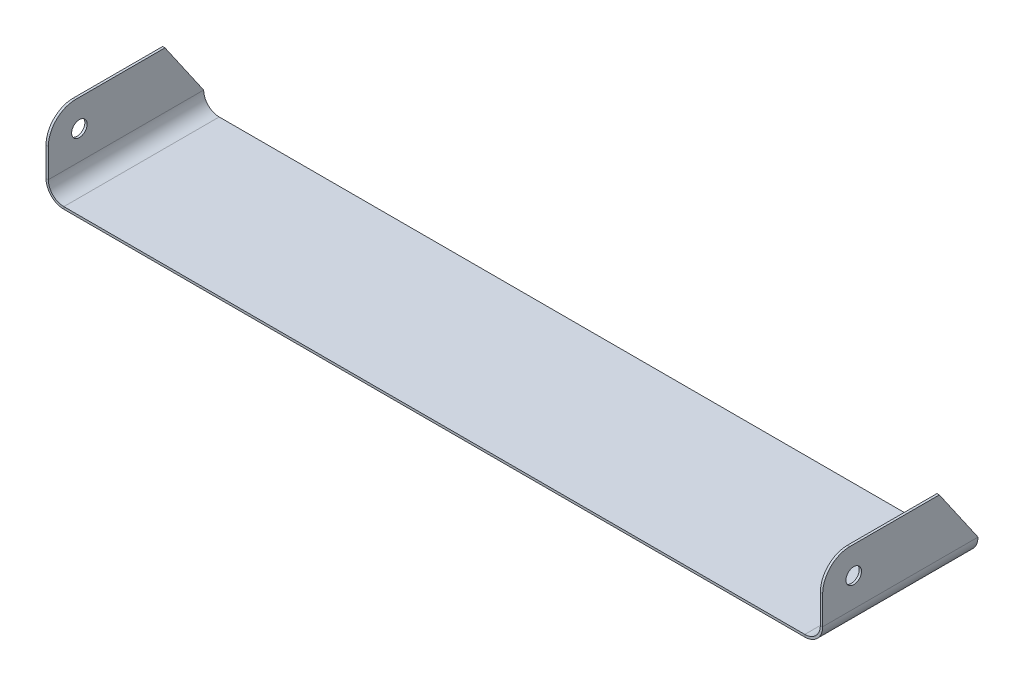
ISO-10303-21;
HEADER;
FILE_DESCRIPTION(('STEP AP214'),'2;1');
FILE_NAME('part.step','',(''),(''),'','','');
FILE_SCHEMA(('AUTOMOTIVE_DESIGN { 1 0 10303 214 1 1 1 1 }'));
ENDSEC;
DATA;
#1=APPLICATION_CONTEXT('core data for automotive mechanical design processes');
#2=APPLICATION_PROTOCOL_DEFINITION('international standard','automotive_design',2000,#1);
#3=PRODUCT_CONTEXT('',#1,'mechanical');
#4=PRODUCT('Part','Part','',(#3));
#5=PRODUCT_RELATED_PRODUCT_CATEGORY('part','',(#4));
#6=PRODUCT_DEFINITION_FORMATION('','',#4);
#7=PRODUCT_DEFINITION_CONTEXT('part definition',#1,'design');
#8=PRODUCT_DEFINITION('design','',#6,#7);
#9=PRODUCT_DEFINITION_SHAPE('','',#8);
#10=(LENGTH_UNIT() NAMED_UNIT(*) SI_UNIT(.MILLI.,.METRE.));
#11=(NAMED_UNIT(*) PLANE_ANGLE_UNIT() SI_UNIT($,.RADIAN.));
#12=(NAMED_UNIT(*) SI_UNIT($,.STERADIAN.) SOLID_ANGLE_UNIT());
#13=UNCERTAINTY_MEASURE_WITH_UNIT(LENGTH_MEASURE(1.E-05),#10,'distance_accuracy_value','');
#14=(GEOMETRIC_REPRESENTATION_CONTEXT(3) GLOBAL_UNCERTAINTY_ASSIGNED_CONTEXT((#13)) GLOBAL_UNIT_ASSIGNED_CONTEXT((#10,
#11,#12)) REPRESENTATION_CONTEXT('',''));
#15=CARTESIAN_POINT('',(0.,0.,0.));
#16=DIRECTION('',(0.,0.,1.));
#17=DIRECTION('',(1.,0.,0.));
#18=AXIS2_PLACEMENT_3D('',#15,#16,#17);
#19=CARTESIAN_POINT('',(0.,-3.,0.));
#20=DIRECTION('',(0.,1.,0.));
#21=DIRECTION('',(0.,0.,1.));
#22=AXIS2_PLACEMENT_3D('',#19,#20,#21);
#23=PLANE('',#22);
#24=DIRECTION('',(0.,0.,-1.));
#25=VECTOR('',#24,1.);
#26=CARTESIAN_POINT('',(477.,-3.00000000000004,-100.));
#27=LINE('',#26,#25);
#28=CARTESIAN_POINT('',(477.,-3.00000000000004,-100.));
#29=VERTEX_POINT('',#28);
#30=CARTESIAN_POINT('',(477.,-3.,100.));
#31=VERTEX_POINT('',#30);
#32=EDGE_CURVE('E204',#29,#31,#27,.F.);
#33=ORIENTED_EDGE('',*,*,#32,.T.);
#34=DIRECTION('',(1.,0.,0.));
#35=VECTOR('',#34,1.);
#36=CARTESIAN_POINT('',(-500.,-3.,100.));
#37=LINE('',#36,#35);
#38=CARTESIAN_POINT('',(-477.,-3.00000000000004,100.));
#39=VERTEX_POINT('',#38);
#40=EDGE_CURVE('E97',#39,#31,#37,.T.);
#41=ORIENTED_EDGE('',*,*,#40,.F.);
#42=DIRECTION('',(0.,0.,1.));
#43=VECTOR('',#42,1.);
#44=CARTESIAN_POINT('',(-477.,-3.00000000000004,100.));
#45=LINE('',#44,#43);
#46=CARTESIAN_POINT('',(-477.,-3.,-100.));
#47=VERTEX_POINT('',#46);
#48=EDGE_CURVE('E280',#39,#47,#45,.F.);
#49=ORIENTED_EDGE('',*,*,#48,.T.);
#50=DIRECTION('',(-1.,0.,0.));
#51=VECTOR('',#50,1.);
#52=CARTESIAN_POINT('',(-500.,-3.,-100.));
#53=LINE('',#52,#51);
#54=EDGE_CURVE('E304',#29,#47,#53,.T.);
#55=ORIENTED_EDGE('',*,*,#54,.F.);
#56=EDGE_LOOP('',(#33,#41,#49,#55));
#57=FACE_BOUND('',#56,.T.);
#58=ADVANCED_FACE('F88',(#57),#23,.F.);
#59=CARTESIAN_POINT('',(0.,0.,0.));
#60=DIRECTION('',(0.,1.,0.));
#61=DIRECTION('',(0.,0.,1.));
#62=AXIS2_PLACEMENT_3D('',#59,#60,#61);
#63=PLANE('',#62);
#64=DIRECTION('',(1.,0.,0.));
#65=VECTOR('',#64,1.);
#66=CARTESIAN_POINT('',(-500.,0.,100.));
#67=LINE('',#66,#65);
#68=CARTESIAN_POINT('',(-477.,0.,100.));
#69=VERTEX_POINT('',#68);
#70=CARTESIAN_POINT('',(477.,0.,100.));
#71=VERTEX_POINT('',#70);
#72=EDGE_CURVE('E306',#69,#71,#67,.T.);
#73=ORIENTED_EDGE('',*,*,#72,.T.);
#74=DIRECTION('',(0.,0.,-1.));
#75=VECTOR('',#74,1.);
#76=CARTESIAN_POINT('',(477.,0.,-100.));
#77=LINE('',#76,#75);
#78=CARTESIAN_POINT('',(477.,0.,-100.));
#79=VERTEX_POINT('',#78);
#80=EDGE_CURVE('E239',#79,#71,#77,.F.);
#81=ORIENTED_EDGE('',*,*,#80,.F.);
#82=DIRECTION('',(-1.,0.,0.));
#83=VECTOR('',#82,1.);
#84=CARTESIAN_POINT('',(-500.,0.,-100.));
#85=LINE('',#84,#83);
#86=CARTESIAN_POINT('',(-477.,0.,-100.));
#87=VERTEX_POINT('',#86);
#88=EDGE_CURVE('E301',#79,#87,#85,.T.);
#89=ORIENTED_EDGE('',*,*,#88,.T.);
#90=DIRECTION('',(0.,0.,1.));
#91=VECTOR('',#90,1.);
#92=CARTESIAN_POINT('',(-477.,0.,100.));
#93=LINE('',#92,#91);
#94=EDGE_CURVE('E293',#69,#87,#93,.F.);
#95=ORIENTED_EDGE('',*,*,#94,.F.);
#96=EDGE_LOOP('',(#73,#81,#89,#95));
#97=FACE_BOUND('',#96,.T.);
#98=ADVANCED_FACE('F313',(#97),#63,.T.);
#99=CARTESIAN_POINT('',(-500.,-3.,-100.));
#100=DIRECTION('',(0.,0.,-1.));
#101=DIRECTION('',(-1.,0.,0.));
#102=AXIS2_PLACEMENT_3D('',#99,#100,#101);
#103=PLANE('',#102);
#104=ORIENTED_EDGE('',*,*,#88,.F.);
#105=DIRECTION('',(0.,-1.,0.));
#106=VECTOR('',#105,1.);
#107=CARTESIAN_POINT('',(477.,0.,-100.));
#108=LINE('',#107,#106);
#109=EDGE_CURVE('E235',#79,#29,#108,.T.);
#110=ORIENTED_EDGE('',*,*,#109,.T.);
#111=ORIENTED_EDGE('',*,*,#54,.T.);
#112=DIRECTION('',(0.,-1.,0.));
#113=VECTOR('',#112,1.);
#114=CARTESIAN_POINT('',(-477.,0.,-100.));
#115=LINE('',#114,#113);
#116=EDGE_CURVE('E298',#87,#47,#115,.T.);
#117=ORIENTED_EDGE('',*,*,#116,.F.);
#118=EDGE_LOOP('',(#104,#110,#111,#117));
#119=FACE_BOUND('',#118,.T.);
#120=ADVANCED_FACE('F90',(#119),#103,.T.);
#121=CARTESIAN_POINT('',(-500.,-3.,100.));
#122=DIRECTION('',(0.,0.,1.));
#123=DIRECTION('',(1.,0.,0.));
#124=AXIS2_PLACEMENT_3D('',#121,#122,#123);
#125=PLANE('',#124);
#126=DIRECTION('',(0.,-1.,0.));
#127=VECTOR('',#126,1.);
#128=CARTESIAN_POINT('',(477.,0.,100.));
#129=LINE('',#128,#127);
#130=EDGE_CURVE('E244',#71,#31,#129,.T.);
#131=ORIENTED_EDGE('',*,*,#130,.F.);
#132=ORIENTED_EDGE('',*,*,#72,.F.);
#133=DIRECTION('',(0.,-1.,0.));
#134=VECTOR('',#133,1.);
#135=CARTESIAN_POINT('',(-477.,0.,100.));
#136=LINE('',#135,#134);
#137=EDGE_CURVE('E287',#69,#39,#136,.T.);
#138=ORIENTED_EDGE('',*,*,#137,.T.);
#139=ORIENTED_EDGE('',*,*,#40,.T.);
#140=EDGE_LOOP('',(#131,#132,#138,#139));
#141=FACE_BOUND('',#140,.T.);
#142=ADVANCED_FACE('F381',(#141),#125,.T.);
#143=CARTESIAN_POINT('',(-477.,20.,-100.));
#144=DIRECTION('',(0.,0.,-1.));
#145=DIRECTION('',(-1.,0.,0.));
#146=AXIS2_PLACEMENT_3D('',#143,#144,#145);
#147=PLANE('',#146);
#148=DIRECTION('',(1.,0.,0.));
#149=VECTOR('',#148,1.);
#150=CARTESIAN_POINT('',(-500.,19.9999999999999,-100.));
#151=LINE('',#150,#149);
#152=CARTESIAN_POINT('',(-497.,19.9999999999999,-100.));
#153=VERTEX_POINT('',#152);
#154=CARTESIAN_POINT('',(-500.,19.9999999999999,-100.));
#155=VERTEX_POINT('',#154);
#156=EDGE_CURVE('E247',#153,#155,#151,.F.);
#157=ORIENTED_EDGE('',*,*,#156,.F.);
#158=CARTESIAN_POINT('',(-477.,20.,-100.));
#159=DIRECTION('',(0.,0.,1.));
#160=DIRECTION('',(1.,0.,0.));
#161=AXIS2_PLACEMENT_3D('',#158,#159,#160);
#162=CIRCLE('',#161,20.);
#163=EDGE_CURVE('E290',#87,#153,#162,.F.);
#164=ORIENTED_EDGE('',*,*,#163,.F.);
#165=ORIENTED_EDGE('',*,*,#116,.T.);
#166=CARTESIAN_POINT('',(-477.,20.,-100.));
#167=DIRECTION('',(0.,0.,1.));
#168=DIRECTION('',(1.,0.,0.));
#169=AXIS2_PLACEMENT_3D('',#166,#167,#168);
#170=CIRCLE('',#169,23.);
#171=EDGE_CURVE('E283',#47,#155,#170,.F.);
#172=ORIENTED_EDGE('',*,*,#171,.T.);
#173=EDGE_LOOP('',(#157,#164,#165,#172));
#174=FACE_BOUND('',#173,.T.);
#175=ADVANCED_FACE('F383',(#174),#147,.T.);
#176=CARTESIAN_POINT('',(-477.,20.,100.));
#177=DIRECTION('',(0.,0.,-1.));
#178=DIRECTION('',(-1.,0.,0.));
#179=AXIS2_PLACEMENT_3D('',#176,#177,#178);
#180=PLANE('',#179);
#181=CARTESIAN_POINT('',(-477.,20.,100.));
#182=DIRECTION('',(0.,0.,1.));
#183=DIRECTION('',(1.,0.,0.));
#184=AXIS2_PLACEMENT_3D('',#181,#182,#183);
#185=CIRCLE('',#184,20.);
#186=CARTESIAN_POINT('',(-497.,19.9999999999999,100.));
#187=VERTEX_POINT('',#186);
#188=EDGE_CURVE('E257',#187,#69,#185,.T.);
#189=ORIENTED_EDGE('',*,*,#188,.F.);
#190=DIRECTION('',(1.,0.,0.));
#191=VECTOR('',#190,1.);
#192=CARTESIAN_POINT('',(-497.,19.9999999999999,100.));
#193=LINE('',#192,#191);
#194=CARTESIAN_POINT('',(-500.,19.9999999999999,100.));
#195=VERTEX_POINT('',#194);
#196=EDGE_CURVE('E274',#187,#195,#193,.F.);
#197=ORIENTED_EDGE('',*,*,#196,.T.);
#198=CARTESIAN_POINT('',(-477.,20.,100.));
#199=DIRECTION('',(0.,0.,1.));
#200=DIRECTION('',(1.,0.,0.));
#201=AXIS2_PLACEMENT_3D('',#198,#199,#200);
#202=CIRCLE('',#201,23.);
#203=EDGE_CURVE('E284',#195,#39,#202,.T.);
#204=ORIENTED_EDGE('',*,*,#203,.T.);
#205=ORIENTED_EDGE('',*,*,#137,.F.);
#206=EDGE_LOOP('',(#189,#197,#204,#205));
#207=FACE_BOUND('',#206,.T.);
#208=ADVANCED_FACE('F379',(#207),#180,.F.);
#209=CARTESIAN_POINT('',(-477.,20.,100.));
#210=DIRECTION('',(0.,0.,1.));
#211=DIRECTION('',(-1.,0.,0.));
#212=AXIS2_PLACEMENT_3D('',#209,#210,#211);
#213=CYLINDRICAL_SURFACE('',#212,23.);
#214=ORIENTED_EDGE('',*,*,#48,.F.);
#215=ORIENTED_EDGE('',*,*,#203,.F.);
#216=DIRECTION('',(0.,0.,1.));
#217=VECTOR('',#216,1.);
#218=CARTESIAN_POINT('',(-500.,19.9999999999999,65.));
#219=LINE('',#218,#217);
#220=EDGE_CURVE('E271',#155,#195,#219,.T.);
#221=ORIENTED_EDGE('',*,*,#220,.F.);
#222=ORIENTED_EDGE('',*,*,#171,.F.);
#223=EDGE_LOOP('',(#214,#215,#221,#222));
#224=FACE_BOUND('',#223,.T.);
#225=ADVANCED_FACE('F408',(#224),#213,.T.);
#226=CARTESIAN_POINT('',(-477.,20.,100.));
#227=DIRECTION('',(0.,0.,1.));
#228=DIRECTION('',(-1.,0.,0.));
#229=AXIS2_PLACEMENT_3D('',#226,#227,#228);
#230=CYLINDRICAL_SURFACE('',#229,20.);
#231=ORIENTED_EDGE('',*,*,#94,.T.);
#232=ORIENTED_EDGE('',*,*,#163,.T.);
#233=DIRECTION('',(0.,0.,-1.));
#234=VECTOR('',#233,1.);
#235=CARTESIAN_POINT('',(-497.,19.9999999999999,-100.));
#236=LINE('',#235,#234);
#237=EDGE_CURVE('E277',#153,#187,#236,.F.);
#238=ORIENTED_EDGE('',*,*,#237,.T.);
#239=ORIENTED_EDGE('',*,*,#188,.T.);
#240=EDGE_LOOP('',(#231,#232,#238,#239));
#241=FACE_BOUND('',#240,.T.);
#242=ADVANCED_FACE('F395',(#241),#230,.F.);
#243=CARTESIAN_POINT('',(-500.,56.9999999999997,100.));
#244=DIRECTION('',(0.,0.,-1.));
#245=DIRECTION('',(-1.,0.,0.));
#246=AXIS2_PLACEMENT_3D('',#243,#244,#245);
#247=PLANE('',#246);
#248=ORIENTED_EDGE('',*,*,#196,.F.);
#249=DIRECTION('',(0.,1.,0.));
#250=VECTOR('',#249,1.);
#251=CARTESIAN_POINT('',(-497.,56.9999999999998,100.));
#252=LINE('',#251,#250);
#253=CARTESIAN_POINT('',(-497.,56.9999999999999,100.));
#254=VERTEX_POINT('',#253);
#255=EDGE_CURVE('E269',#187,#254,#252,.T.);
#256=ORIENTED_EDGE('',*,*,#255,.T.);
#257=DIRECTION('',(1.,0.,0.));
#258=VECTOR('',#257,1.);
#259=CARTESIAN_POINT('',(-500.,56.9999999999997,100.));
#260=LINE('',#259,#258);
#261=CARTESIAN_POINT('',(-500.,56.9999999999999,100.));
#262=VERTEX_POINT('',#261);
#263=EDGE_CURVE('E253',#262,#254,#260,.T.);
#264=ORIENTED_EDGE('',*,*,#263,.F.);
#265=DIRECTION('',(0.,-1.,0.));
#266=VECTOR('',#265,1.);
#267=CARTESIAN_POINT('',(-500.,57.,100.));
#268=LINE('',#267,#266);
#269=EDGE_CURVE('E262',#195,#262,#268,.F.);
#270=ORIENTED_EDGE('',*,*,#269,.F.);
#271=EDGE_LOOP('',(#248,#256,#264,#270));
#272=FACE_BOUND('',#271,.T.);
#273=ADVANCED_FACE('F413',(#272),#247,.F.);
#274=CARTESIAN_POINT('',(-500.,57.,65.));
#275=DIRECTION('',(-1.,0.,0.));
#276=DIRECTION('',(0.,-1.,0.));
#277=AXIS2_PLACEMENT_3D('',#274,#275,#276);
#278=PLANE('',#277);
#279=DIRECTION('',(0.,0.822276678257091,0.56908792325482));
#280=VECTOR('',#279,1.);
#281=CARTESIAN_POINT('',(-500.,19.9999999999999,-100.));
#282=LINE('',#281,#280);
#283=CARTESIAN_POINT('',(-500.,92.,-50.1696551078199));
#284=VERTEX_POINT('',#283);
#285=EDGE_CURVE('E104',#155,#284,#282,.T.);
#286=ORIENTED_EDGE('',*,*,#285,.F.);
#287=ORIENTED_EDGE('',*,*,#220,.T.);
#288=ORIENTED_EDGE('',*,*,#269,.T.);
#289=CARTESIAN_POINT('',(-500.,57.,65.));
#290=DIRECTION('',(-1.,0.,0.));
#291=DIRECTION('',(0.,-1.,0.));
#292=AXIS2_PLACEMENT_3D('',#289,#290,#291);
#293=CIRCLE('',#292,35.);
#294=CARTESIAN_POINT('',(-500.,92.,64.9999999999998));
#295=VERTEX_POINT('',#294);
#296=EDGE_CURVE('E260',#262,#295,#293,.T.);
#297=ORIENTED_EDGE('',*,*,#296,.T.);
#298=DIRECTION('',(0.,0.,1.));
#299=VECTOR('',#298,1.);
#300=CARTESIAN_POINT('',(-500.,92.,65.));
#301=LINE('',#300,#299);
#302=EDGE_CURVE('E254',#295,#284,#301,.F.);
#303=ORIENTED_EDGE('',*,*,#302,.T.);
#304=EDGE_LOOP('',(#286,#287,#288,#297,#303));
#305=FACE_BOUND('',#304,.T.);
#306=CARTESIAN_POINT('',(-500.,56.9999999999999,60.));
#307=DIRECTION('',(-1.,0.,0.));
#308=DIRECTION('',(0.,-1.,0.));
#309=AXIS2_PLACEMENT_3D('',#306,#307,#308);
#310=CIRCLE('',#309,10.);
#311=CARTESIAN_POINT('',(-500.,46.9999999999999,60.));
#312=VERTEX_POINT('',#311);
#313=EDGE_CURVE('E405',#312,#312,#310,.T.);
#314=ORIENTED_EDGE('',*,*,#313,.F.);
#315=EDGE_LOOP('',(#314));
#316=FACE_BOUND('',#315,.T.);
#317=ADVANCED_FACE('F401',(#305,#316),#278,.T.);
#318=CARTESIAN_POINT('',(-497.,57.,65.));
#319=DIRECTION('',(-1.,0.,0.));
#320=DIRECTION('',(0.,-1.,0.));
#321=AXIS2_PLACEMENT_3D('',#318,#319,#320);
#322=PLANE('',#321);
#323=CARTESIAN_POINT('',(-497.,56.9999999999999,60.));
#324=DIRECTION('',(-1.,0.,0.));
#325=DIRECTION('',(0.,-1.,0.));
#326=AXIS2_PLACEMENT_3D('',#323,#324,#325);
#327=CIRCLE('',#326,10.);
#328=CARTESIAN_POINT('',(-497.,46.9999999999999,60.));
#329=VERTEX_POINT('',#328);
#330=EDGE_CURVE('E232',#329,#329,#327,.T.);
#331=ORIENTED_EDGE('',*,*,#330,.T.);
#332=EDGE_LOOP('',(#331));
#333=FACE_BOUND('',#332,.T.);
#334=ORIENTED_EDGE('',*,*,#237,.F.);
#335=DIRECTION('',(0.,0.822276678257091,0.56908792325482));
#336=VECTOR('',#335,1.);
#337=CARTESIAN_POINT('',(-497.,122.228515600487,-29.2488584696127));
#338=LINE('',#337,#336);
#339=CARTESIAN_POINT('',(-497.,92.,-50.1696551078199));
#340=VERTEX_POINT('',#339);
#341=EDGE_CURVE('E336',#153,#340,#338,.T.);
#342=ORIENTED_EDGE('',*,*,#341,.T.);
#343=DIRECTION('',(0.,0.,-1.));
#344=VECTOR('',#343,1.);
#345=CARTESIAN_POINT('',(-497.,92.,-100.));
#346=LINE('',#345,#344);
#347=CARTESIAN_POINT('',(-497.,92.,64.9999999999998));
#348=VERTEX_POINT('',#347);
#349=EDGE_CURVE('E264',#348,#340,#346,.T.);
#350=ORIENTED_EDGE('',*,*,#349,.F.);
#351=CARTESIAN_POINT('',(-497.,57.,65.));
#352=DIRECTION('',(-1.,0.,0.));
#353=DIRECTION('',(0.,-1.,0.));
#354=AXIS2_PLACEMENT_3D('',#351,#352,#353);
#355=CIRCLE('',#354,35.);
#356=EDGE_CURVE('E267',#254,#348,#355,.T.);
#357=ORIENTED_EDGE('',*,*,#356,.F.);
#358=ORIENTED_EDGE('',*,*,#255,.F.);
#359=EDGE_LOOP('',(#334,#342,#350,#357,#358));
#360=FACE_BOUND('',#359,.T.);
#361=ADVANCED_FACE('F424',(#333,#360),#322,.F.);
#362=CARTESIAN_POINT('',(-500.,57.,65.));
#363=DIRECTION('',(1.,0.,0.));
#364=DIRECTION('',(0.,1.,0.));
#365=AXIS2_PLACEMENT_3D('',#362,#363,#364);
#366=CYLINDRICAL_SURFACE('',#365,35.);
#367=ORIENTED_EDGE('',*,*,#356,.T.);
#368=DIRECTION('',(1.,0.,0.));
#369=VECTOR('',#368,1.);
#370=CARTESIAN_POINT('',(-500.,92.,64.9999999999997));
#371=LINE('',#370,#369);
#372=EDGE_CURVE('E250',#295,#348,#371,.T.);
#373=ORIENTED_EDGE('',*,*,#372,.F.);
#374=ORIENTED_EDGE('',*,*,#296,.F.);
#375=ORIENTED_EDGE('',*,*,#263,.T.);
#376=EDGE_LOOP('',(#367,#373,#374,#375));
#377=FACE_BOUND('',#376,.T.);
#378=ADVANCED_FACE('F418',(#377),#366,.T.);
#379=CARTESIAN_POINT('',(-500.,92.,-100.));
#380=DIRECTION('',(0.,-1.,0.));
#381=DIRECTION('',(1.,0.,0.));
#382=AXIS2_PLACEMENT_3D('',#379,#380,#381);
#383=PLANE('',#382);
#384=ORIENTED_EDGE('',*,*,#349,.T.);
#385=DIRECTION('',(-1.,0.,0.));
#386=VECTOR('',#385,1.);
#387=CARTESIAN_POINT('',(-500.,92.,-50.1696551078199));
#388=LINE('',#387,#386);
#389=EDGE_CURVE('E334',#340,#284,#388,.T.);
#390=ORIENTED_EDGE('',*,*,#389,.T.);
#391=ORIENTED_EDGE('',*,*,#302,.F.);
#392=ORIENTED_EDGE('',*,*,#372,.T.);
#393=EDGE_LOOP('',(#384,#390,#391,#392));
#394=FACE_BOUND('',#393,.T.);
#395=ADVANCED_FACE('F422',(#394),#383,.F.);
#396=CARTESIAN_POINT('',(477.,20.,100.));
#397=DIRECTION('',(0.,0.,1.));
#398=DIRECTION('',(1.,0.,0.));
#399=AXIS2_PLACEMENT_3D('',#396,#397,#398);
#400=PLANE('',#399);
#401=DIRECTION('',(-1.,0.,0.));
#402=VECTOR('',#401,1.);
#403=CARTESIAN_POINT('',(500.,19.9999999999999,100.));
#404=LINE('',#403,#402);
#405=CARTESIAN_POINT('',(497.,19.9999999999999,100.));
#406=VERTEX_POINT('',#405);
#407=CARTESIAN_POINT('',(500.,19.9999999999999,100.));
#408=VERTEX_POINT('',#407);
#409=EDGE_CURVE('E229',#406,#408,#404,.F.);
#410=ORIENTED_EDGE('',*,*,#409,.F.);
#411=CARTESIAN_POINT('',(477.,20.,100.));
#412=DIRECTION('',(0.,0.,-1.));
#413=DIRECTION('',(-1.,0.,0.));
#414=AXIS2_PLACEMENT_3D('',#411,#412,#413);
#415=CIRCLE('',#414,20.);
#416=EDGE_CURVE('E207',#71,#406,#415,.F.);
#417=ORIENTED_EDGE('',*,*,#416,.F.);
#418=ORIENTED_EDGE('',*,*,#130,.T.);
#419=CARTESIAN_POINT('',(477.,20.,100.));
#420=DIRECTION('',(0.,0.,-1.));
#421=DIRECTION('',(-1.,0.,0.));
#422=AXIS2_PLACEMENT_3D('',#419,#420,#421);
#423=CIRCLE('',#422,23.);
#424=EDGE_CURVE('E234',#31,#408,#423,.F.);
#425=ORIENTED_EDGE('',*,*,#424,.T.);
#426=EDGE_LOOP('',(#410,#417,#418,#425));
#427=FACE_BOUND('',#426,.T.);
#428=ADVANCED_FACE('F322',(#427),#400,.T.);
#429=CARTESIAN_POINT('',(477.,20.,-100.));
#430=DIRECTION('',(0.,0.,1.));
#431=DIRECTION('',(1.,0.,0.));
#432=AXIS2_PLACEMENT_3D('',#429,#430,#431);
#433=PLANE('',#432);
#434=CARTESIAN_POINT('',(477.,20.,-100.));
#435=DIRECTION('',(0.,0.,-1.));
#436=DIRECTION('',(-1.,0.,0.));
#437=AXIS2_PLACEMENT_3D('',#434,#435,#436);
#438=CIRCLE('',#437,20.);
#439=CARTESIAN_POINT('',(497.,20.0000000000034,-100.));
#440=VERTEX_POINT('',#439);
#441=EDGE_CURVE('E212',#440,#79,#438,.T.);
#442=ORIENTED_EDGE('',*,*,#441,.F.);
#443=DIRECTION('',(-1.,0.,0.));
#444=VECTOR('',#443,1.);
#445=CARTESIAN_POINT('',(497.,19.9999999999999,-100.));
#446=LINE('',#445,#444);
#447=CARTESIAN_POINT('',(500.000000000001,20.0000000000034,-100.));
#448=VERTEX_POINT('',#447);
#449=EDGE_CURVE('E191',#440,#448,#446,.F.);
#450=ORIENTED_EDGE('',*,*,#449,.T.);
#451=CARTESIAN_POINT('',(477.,20.,-100.));
#452=DIRECTION('',(0.,0.,-1.));
#453=DIRECTION('',(-1.,0.,0.));
#454=AXIS2_PLACEMENT_3D('',#451,#452,#453);
#455=CIRCLE('',#454,23.);
#456=EDGE_CURVE('E199',#448,#29,#455,.T.);
#457=ORIENTED_EDGE('',*,*,#456,.T.);
#458=ORIENTED_EDGE('',*,*,#109,.F.);
#459=EDGE_LOOP('',(#442,#450,#457,#458));
#460=FACE_BOUND('',#459,.T.);
#461=ADVANCED_FACE('F210',(#460),#433,.F.);
#462=CARTESIAN_POINT('',(477.,20.,-100.));
#463=DIRECTION('',(0.,0.,-1.));
#464=DIRECTION('',(1.,0.,0.));
#465=AXIS2_PLACEMENT_3D('',#462,#463,#464);
#466=CYLINDRICAL_SURFACE('',#465,23.);
#467=ORIENTED_EDGE('',*,*,#32,.F.);
#468=ORIENTED_EDGE('',*,*,#456,.F.);
#469=DIRECTION('',(0.,0.,-1.));
#470=VECTOR('',#469,1.);
#471=CARTESIAN_POINT('',(500.,19.9999999999999,65.));
#472=LINE('',#471,#470);
#473=EDGE_CURVE('E202',#408,#448,#472,.T.);
#474=ORIENTED_EDGE('',*,*,#473,.F.);
#475=ORIENTED_EDGE('',*,*,#424,.F.);
#476=EDGE_LOOP('',(#467,#468,#474,#475));
#477=FACE_BOUND('',#476,.T.);
#478=ADVANCED_FACE('F200',(#477),#466,.T.);
#479=CARTESIAN_POINT('',(477.,20.,-100.));
#480=DIRECTION('',(0.,0.,-1.));
#481=DIRECTION('',(1.,0.,0.));
#482=AXIS2_PLACEMENT_3D('',#479,#480,#481);
#483=CYLINDRICAL_SURFACE('',#482,20.);
#484=ORIENTED_EDGE('',*,*,#80,.T.);
#485=ORIENTED_EDGE('',*,*,#416,.T.);
#486=DIRECTION('',(0.,0.,1.));
#487=VECTOR('',#486,1.);
#488=CARTESIAN_POINT('',(497.,19.9999999999999,100.));
#489=LINE('',#488,#487);
#490=EDGE_CURVE('E213',#406,#440,#489,.F.);
#491=ORIENTED_EDGE('',*,*,#490,.T.);
#492=ORIENTED_EDGE('',*,*,#441,.T.);
#493=EDGE_LOOP('',(#484,#485,#491,#492));
#494=FACE_BOUND('',#493,.T.);
#495=ADVANCED_FACE('F319',(#494),#483,.F.);
#496=CARTESIAN_POINT('',(500.,0.,100.));
#497=DIRECTION('',(0.,0.,-1.));
#498=DIRECTION('',(-1.,0.,0.));
#499=AXIS2_PLACEMENT_3D('',#496,#497,#498);
#500=PLANE('',#499);
#501=ORIENTED_EDGE('',*,*,#409,.T.);
#502=DIRECTION('',(0.,1.,0.));
#503=VECTOR('',#502,1.);
#504=CARTESIAN_POINT('',(500.,57.,100.));
#505=LINE('',#504,#503);
#506=CARTESIAN_POINT('',(500.,56.9999999999999,100.));
#507=VERTEX_POINT('',#506);
#508=EDGE_CURVE('E219',#507,#408,#505,.F.);
#509=ORIENTED_EDGE('',*,*,#508,.F.);
#510=DIRECTION('',(-1.,0.,0.));
#511=VECTOR('',#510,1.);
#512=CARTESIAN_POINT('',(500.,56.9999999999998,100.));
#513=LINE('',#512,#511);
#514=CARTESIAN_POINT('',(497.,56.9999999999999,100.));
#515=VERTEX_POINT('',#514);
#516=EDGE_CURVE('E328',#507,#515,#513,.T.);
#517=ORIENTED_EDGE('',*,*,#516,.T.);
#518=DIRECTION('',(0.,-1.,0.));
#519=VECTOR('',#518,1.);
#520=CARTESIAN_POINT('',(497.,0.,100.));
#521=LINE('',#520,#519);
#522=EDGE_CURVE('E220',#515,#406,#521,.T.);
#523=ORIENTED_EDGE('',*,*,#522,.T.);
#524=EDGE_LOOP('',(#501,#509,#517,#523));
#525=FACE_BOUND('',#524,.T.);
#526=ADVANCED_FACE('F324',(#525),#500,.F.);
#527=CARTESIAN_POINT('',(500.,57.,65.));
#528=DIRECTION('',(1.,0.,0.));
#529=DIRECTION('',(0.,1.,0.));
#530=AXIS2_PLACEMENT_3D('',#527,#528,#529);
#531=PLANE('',#530);
#532=DIRECTION('',(0.,0.822276678257091,0.56908792325482));
#533=VECTOR('',#532,1.);
#534=CARTESIAN_POINT('',(500.000000000001,20.0000000000034,-100.));
#535=LINE('',#534,#533);
#536=CARTESIAN_POINT('',(500.000000000001,92.,-50.1696551078223));
#537=VERTEX_POINT('',#536);
#538=EDGE_CURVE('E187',#448,#537,#535,.T.);
#539=ORIENTED_EDGE('',*,*,#538,.T.);
#540=DIRECTION('',(0.,0.,-1.));
#541=VECTOR('',#540,1.);
#542=CARTESIAN_POINT('',(500.000000000001,92.,65.));
#543=LINE('',#542,#541);
#544=CARTESIAN_POINT('',(500.000000000001,92.,64.9999999999998));
#545=VERTEX_POINT('',#544);
#546=EDGE_CURVE('E351',#537,#545,#543,.F.);
#547=ORIENTED_EDGE('',*,*,#546,.T.);
#548=CARTESIAN_POINT('',(500.,57.,65.));
#549=DIRECTION('',(1.,0.,0.));
#550=DIRECTION('',(0.,1.,0.));
#551=AXIS2_PLACEMENT_3D('',#548,#549,#550);
#552=CIRCLE('',#551,35.);
#553=EDGE_CURVE('E347',#545,#507,#552,.T.);
#554=ORIENTED_EDGE('',*,*,#553,.T.);
#555=ORIENTED_EDGE('',*,*,#508,.T.);
#556=ORIENTED_EDGE('',*,*,#473,.T.);
#557=EDGE_LOOP('',(#539,#547,#554,#555,#556));
#558=FACE_BOUND('',#557,.T.);
#559=CARTESIAN_POINT('',(500.000000000001,57.0000000000034,60.));
#560=DIRECTION('',(-1.,0.,0.));
#561=DIRECTION('',(0.,-1.,0.));
#562=AXIS2_PLACEMENT_3D('',#559,#560,#561);
#563=CIRCLE('',#562,10.);
#564=CARTESIAN_POINT('',(500.000000000001,47.0000000000034,60.));
#565=VERTEX_POINT('',#564);
#566=EDGE_CURVE('E339',#565,#565,#563,.T.);
#567=ORIENTED_EDGE('',*,*,#566,.T.);
#568=EDGE_LOOP('',(#567));
#569=FACE_BOUND('',#568,.T.);
#570=ADVANCED_FACE('F216',(#558,#569),#531,.T.);
#571=CARTESIAN_POINT('',(497.,57.,65.));
#572=DIRECTION('',(1.,0.,0.));
#573=DIRECTION('',(0.,1.,0.));
#574=AXIS2_PLACEMENT_3D('',#571,#572,#573);
#575=PLANE('',#574);
#576=CARTESIAN_POINT('',(497.,57.0000000000033,60.));
#577=DIRECTION('',(1.,0.,0.));
#578=DIRECTION('',(0.,1.,0.));
#579=AXIS2_PLACEMENT_3D('',#576,#577,#578);
#580=CIRCLE('',#579,10.);
#581=CARTESIAN_POINT('',(497.000000000001,67.0000000000034,60.));
#582=VERTEX_POINT('',#581);
#583=EDGE_CURVE('E92',#582,#582,#580,.T.);
#584=ORIENTED_EDGE('',*,*,#583,.T.);
#585=EDGE_LOOP('',(#584));
#586=FACE_BOUND('',#585,.T.);
#587=DIRECTION('',(0.,0.,1.));
#588=VECTOR('',#587,1.);
#589=CARTESIAN_POINT('',(497.000000000001,92.,64.9999999999997));
#590=LINE('',#589,#588);
#591=CARTESIAN_POINT('',(497.000000000001,92.,-50.1696551078223));
#592=VERTEX_POINT('',#591);
#593=CARTESIAN_POINT('',(497.000000000001,92.,64.9999999999998));
#594=VERTEX_POINT('',#593);
#595=EDGE_CURVE('E223',#592,#594,#590,.T.);
#596=ORIENTED_EDGE('',*,*,#595,.F.);
#597=DIRECTION('',(0.,-0.822276678257091,-0.56908792325482));
#598=VECTOR('',#597,1.);
#599=CARTESIAN_POINT('',(497.000000000001,122.228515600488,-29.2488584696143));
#600=LINE('',#599,#598);
#601=EDGE_CURVE('E112',#592,#440,#600,.T.);
#602=ORIENTED_EDGE('',*,*,#601,.T.);
#603=ORIENTED_EDGE('',*,*,#490,.F.);
#604=ORIENTED_EDGE('',*,*,#522,.F.);
#605=CARTESIAN_POINT('',(497.,57.,65.));
#606=DIRECTION('',(1.,0.,0.));
#607=DIRECTION('',(0.,1.,0.));
#608=AXIS2_PLACEMENT_3D('',#605,#606,#607);
#609=CIRCLE('',#608,35.);
#610=EDGE_CURVE('E333',#594,#515,#609,.T.);
#611=ORIENTED_EDGE('',*,*,#610,.F.);
#612=EDGE_LOOP('',(#596,#602,#603,#604,#611));
#613=FACE_BOUND('',#612,.T.);
#614=ADVANCED_FACE('F332',(#586,#613),#575,.F.);
#615=CARTESIAN_POINT('',(500.000000000001,92.,64.9999999999997));
#616=DIRECTION('',(0.,-1.,0.));
#617=DIRECTION('',(1.,0.,0.));
#618=AXIS2_PLACEMENT_3D('',#615,#616,#617);
#619=PLANE('',#618);
#620=ORIENTED_EDGE('',*,*,#546,.F.);
#621=DIRECTION('',(-1.,0.,0.));
#622=VECTOR('',#621,1.);
#623=CARTESIAN_POINT('',(500.,92.,-50.1696551078223));
#624=LINE('',#623,#622);
#625=EDGE_CURVE('E13',#537,#592,#624,.T.);
#626=ORIENTED_EDGE('',*,*,#625,.T.);
#627=ORIENTED_EDGE('',*,*,#595,.T.);
#628=DIRECTION('',(-1.,0.,0.));
#629=VECTOR('',#628,1.);
#630=CARTESIAN_POINT('',(500.000000000001,92.,64.9999999999997));
#631=LINE('',#630,#629);
#632=EDGE_CURVE('E243',#545,#594,#631,.T.);
#633=ORIENTED_EDGE('',*,*,#632,.F.);
#634=EDGE_LOOP('',(#620,#626,#627,#633));
#635=FACE_BOUND('',#634,.T.);
#636=ADVANCED_FACE('F356',(#635),#619,.F.);
#637=CARTESIAN_POINT('',(500.,57.,65.));
#638=DIRECTION('',(-1.,0.,0.));
#639=DIRECTION('',(0.,-1.,0.));
#640=AXIS2_PLACEMENT_3D('',#637,#638,#639);
#641=CYLINDRICAL_SURFACE('',#640,35.);
#642=ORIENTED_EDGE('',*,*,#610,.T.);
#643=ORIENTED_EDGE('',*,*,#516,.F.);
#644=ORIENTED_EDGE('',*,*,#553,.F.);
#645=ORIENTED_EDGE('',*,*,#632,.T.);
#646=EDGE_LOOP('',(#642,#643,#644,#645));
#647=FACE_BOUND('',#646,.T.);
#648=ADVANCED_FACE('F359',(#647),#641,.T.);
#649=CARTESIAN_POINT('',(500.000000000001,20.0000000000034,-100.));
#650=DIRECTION('',(0.,-0.56908792325482,0.822276678257091));
#651=DIRECTION('',(0.,-0.822276678257091,-0.56908792325482));
#652=AXIS2_PLACEMENT_3D('',#649,#650,#651);
#653=PLANE('',#652);
#654=ORIENTED_EDGE('',*,*,#625,.F.);
#655=ORIENTED_EDGE('',*,*,#538,.F.);
#656=ORIENTED_EDGE('',*,*,#449,.F.);
#657=ORIENTED_EDGE('',*,*,#601,.F.);
#658=EDGE_LOOP('',(#654,#655,#656,#657));
#659=FACE_BOUND('',#658,.T.);
#660=ADVANCED_FACE('F189',(#659),#653,.F.);
#661=CARTESIAN_POINT('',(500.000000000001,57.0000000000034,60.));
#662=DIRECTION('',(-1.,0.,0.));
#663=DIRECTION('',(0.,-1.,0.));
#664=AXIS2_PLACEMENT_3D('',#661,#662,#663);
#665=CYLINDRICAL_SURFACE('',#664,10.);
#666=ORIENTED_EDGE('',*,*,#566,.F.);
#667=EDGE_LOOP('',(#666));
#668=FACE_BOUND('',#667,.T.);
#669=ORIENTED_EDGE('',*,*,#583,.F.);
#670=EDGE_LOOP('',(#669));
#671=FACE_BOUND('',#670,.T.);
#672=ADVANCED_FACE('F366',(#668,#671),#665,.F.);
#673=ORIENTED_EDGE('',*,*,#156,.T.);
#674=ORIENTED_EDGE('',*,*,#285,.T.);
#675=ORIENTED_EDGE('',*,*,#389,.F.);
#676=ORIENTED_EDGE('',*,*,#341,.F.);
#677=EDGE_LOOP('',(#673,#674,#675,#676));
#678=FACE_BOUND('',#677,.T.);
#679=ADVANCED_FACE('F368',(#678),#653,.F.);
#680=ORIENTED_EDGE('',*,*,#313,.T.);
#681=EDGE_LOOP('',(#680));
#682=FACE_BOUND('',#681,.T.);
#683=ORIENTED_EDGE('',*,*,#330,.F.);
#684=EDGE_LOOP('',(#683));
#685=FACE_BOUND('',#684,.T.);
#686=ADVANCED_FACE('F672',(#682,#685),#665,.F.);
#687=CLOSED_SHELL('',(#58,#98,#120,#142,#175,#208,#225,#242,#273,#317,#361,#378,#395,#428,#461,
#478,#495,#526,#570,#614,#636,#648,#660,#672,#679,#686));
#688=MANIFOLD_SOLID_BREP('B2',#687);
#689=ADVANCED_BREP_SHAPE_REPRESENTATION('',(#18,#688),#14);
#690=SHAPE_DEFINITION_REPRESENTATION(#9,#689);
ENDSEC;
END-ISO-10303-21;
